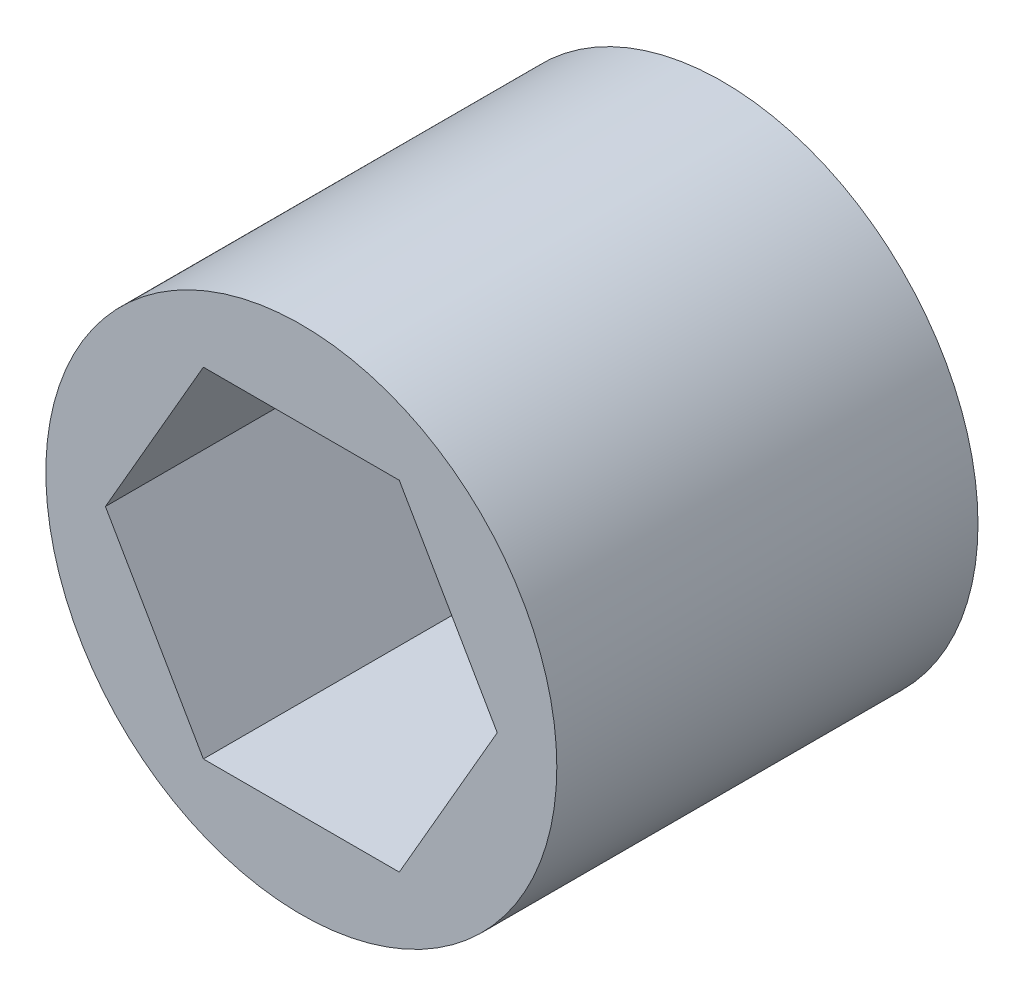
ISO-10303-21;
HEADER;
FILE_DESCRIPTION(('STEP AP214'),'2;1');
FILE_NAME('part.step','',(''),(''),'','','');
FILE_SCHEMA(('AUTOMOTIVE_DESIGN { 1 0 10303 214 1 1 1 1 }'));
ENDSEC;
DATA;
#1=APPLICATION_CONTEXT('core data for automotive mechanical design processes');
#2=APPLICATION_PROTOCOL_DEFINITION('international standard','automotive_design',2000,#1);
#3=PRODUCT_CONTEXT('',#1,'mechanical');
#4=PRODUCT('Part','Part','',(#3));
#5=PRODUCT_RELATED_PRODUCT_CATEGORY('part','',(#4));
#6=PRODUCT_DEFINITION_FORMATION('','',#4);
#7=PRODUCT_DEFINITION_CONTEXT('part definition',#1,'design');
#8=PRODUCT_DEFINITION('design','',#6,#7);
#9=PRODUCT_DEFINITION_SHAPE('','',#8);
#10=(LENGTH_UNIT() NAMED_UNIT(*) SI_UNIT(.MILLI.,.METRE.));
#11=(NAMED_UNIT(*) PLANE_ANGLE_UNIT() SI_UNIT($,.RADIAN.));
#12=(NAMED_UNIT(*) SI_UNIT($,.STERADIAN.) SOLID_ANGLE_UNIT());
#13=UNCERTAINTY_MEASURE_WITH_UNIT(LENGTH_MEASURE(1.E-05),#10,'distance_accuracy_value','');
#14=(GEOMETRIC_REPRESENTATION_CONTEXT(3) GLOBAL_UNCERTAINTY_ASSIGNED_CONTEXT((#13)) GLOBAL_UNIT_ASSIGNED_CONTEXT((#10,
#11,#12)) REPRESENTATION_CONTEXT('',''));
#15=CARTESIAN_POINT('',(0.,0.,0.));
#16=DIRECTION('',(0.,0.,1.));
#17=DIRECTION('',(1.,0.,0.));
#18=AXIS2_PLACEMENT_3D('',#15,#16,#17);
#19=CARTESIAN_POINT('',(0.,0.,16.0782));
#20=DIRECTION('',(0.,0.,1.));
#21=DIRECTION('',(1.,0.,0.));
#22=AXIS2_PLACEMENT_3D('',#19,#20,#21);
#23=PLANE('',#22);
#24=CARTESIAN_POINT('',(0.,0.,16.0782));
#25=DIRECTION('',(0.,0.,1.));
#26=DIRECTION('',(1.,0.,0.));
#27=AXIS2_PLACEMENT_3D('',#24,#25,#26);
#28=CIRCLE('',#27,9.7536);
#29=CARTESIAN_POINT('',(9.7536,0.,16.0782));
#30=VERTEX_POINT('',#29);
#31=EDGE_CURVE('E11',#30,#30,#28,.T.);
#32=ORIENTED_EDGE('',*,*,#31,.T.);
#33=EDGE_LOOP('',(#32));
#34=FACE_BOUND('',#33,.T.);
#35=DIRECTION('',(-0.5,0.866025403784438,0.));
#36=VECTOR('',#35,1.);
#37=CARTESIAN_POINT('',(7.47899538708242,0.,16.0782));
#38=LINE('',#37,#36);
#39=CARTESIAN_POINT('',(7.47899538708242,0.,16.0782));
#40=VERTEX_POINT('',#39);
#41=CARTESIAN_POINT('',(3.73949769354121,6.477,16.0782));
#42=VERTEX_POINT('',#41);
#43=EDGE_CURVE('E94',#40,#42,#38,.T.);
#44=ORIENTED_EDGE('',*,*,#43,.F.);
#45=DIRECTION('',(0.5,0.866025403784439,0.));
#46=VECTOR('',#45,1.);
#47=CARTESIAN_POINT('',(3.73949769354121,-6.477,16.0782));
#48=LINE('',#47,#46);
#49=CARTESIAN_POINT('',(3.73949769354121,-6.477,16.0782));
#50=VERTEX_POINT('',#49);
#51=EDGE_CURVE('E86',#50,#40,#48,.T.);
#52=ORIENTED_EDGE('',*,*,#51,.F.);
#53=DIRECTION('',(1.,0.,0.));
#54=VECTOR('',#53,1.);
#55=CARTESIAN_POINT('',(-3.7394976935412,-6.477,16.0782));
#56=LINE('',#55,#54);
#57=CARTESIAN_POINT('',(-3.7394976935412,-6.477,16.0782));
#58=VERTEX_POINT('',#57);
#59=EDGE_CURVE('E114',#58,#50,#56,.T.);
#60=ORIENTED_EDGE('',*,*,#59,.F.);
#61=DIRECTION('',(0.5,-0.866025403784438,0.));
#62=VECTOR('',#61,1.);
#63=CARTESIAN_POINT('',(-7.47899538708241,0.,16.0782));
#64=LINE('',#63,#62);
#65=CARTESIAN_POINT('',(-7.47899538708241,0.,16.0782));
#66=VERTEX_POINT('',#65);
#67=EDGE_CURVE('E112',#66,#58,#64,.T.);
#68=ORIENTED_EDGE('',*,*,#67,.F.);
#69=DIRECTION('',(-0.5,-0.866025403784439,0.));
#70=VECTOR('',#69,1.);
#71=CARTESIAN_POINT('',(-3.7394976935412,6.477,16.0782));
#72=LINE('',#71,#70);
#73=CARTESIAN_POINT('',(-3.7394976935412,6.477,16.0782));
#74=VERTEX_POINT('',#73);
#75=EDGE_CURVE('E108',#74,#66,#72,.T.);
#76=ORIENTED_EDGE('',*,*,#75,.F.);
#77=DIRECTION('',(-1.,0.,0.));
#78=VECTOR('',#77,1.);
#79=CARTESIAN_POINT('',(3.73949769354121,6.477,16.0782));
#80=LINE('',#79,#78);
#81=EDGE_CURVE('E106',#42,#74,#80,.T.);
#82=ORIENTED_EDGE('',*,*,#81,.F.);
#83=EDGE_LOOP('',(#44,#52,#60,#68,#76,#82));
#84=FACE_BOUND('',#83,.T.);
#85=ADVANCED_FACE('F33',(#34,#84),#23,.T.);
#86=CARTESIAN_POINT('',(0.,0.,0.));
#87=DIRECTION('',(0.,0.,1.));
#88=DIRECTION('',(1.,0.,0.));
#89=AXIS2_PLACEMENT_3D('',#86,#87,#88);
#90=PLANE('',#89);
#91=CARTESIAN_POINT('',(0.,0.,0.));
#92=DIRECTION('',(0.,0.,1.));
#93=DIRECTION('',(1.,0.,0.));
#94=AXIS2_PLACEMENT_3D('',#91,#92,#93);
#95=CIRCLE('',#94,9.7536);
#96=CARTESIAN_POINT('',(9.7536,0.,0.));
#97=VERTEX_POINT('',#96);
#98=EDGE_CURVE('E37',#97,#97,#95,.T.);
#99=ORIENTED_EDGE('',*,*,#98,.F.);
#100=EDGE_LOOP('',(#99));
#101=FACE_BOUND('',#100,.T.);
#102=DIRECTION('',(0.5,0.866025403784439,0.));
#103=VECTOR('',#102,1.);
#104=CARTESIAN_POINT('',(3.73949769354121,-6.477,0.));
#105=LINE('',#104,#103);
#106=CARTESIAN_POINT('',(3.73949769354121,-6.477,0.));
#107=VERTEX_POINT('',#106);
#108=CARTESIAN_POINT('',(7.47899538708242,0.,0.));
#109=VERTEX_POINT('',#108);
#110=EDGE_CURVE('E56',#107,#109,#105,.T.);
#111=ORIENTED_EDGE('',*,*,#110,.T.);
#112=DIRECTION('',(-0.5,0.866025403784438,0.));
#113=VECTOR('',#112,1.);
#114=CARTESIAN_POINT('',(7.47899538708242,0.,0.));
#115=LINE('',#114,#113);
#116=CARTESIAN_POINT('',(3.73949769354121,6.477,0.));
#117=VERTEX_POINT('',#116);
#118=EDGE_CURVE('E101',#109,#117,#115,.T.);
#119=ORIENTED_EDGE('',*,*,#118,.T.);
#120=DIRECTION('',(-1.,0.,0.));
#121=VECTOR('',#120,1.);
#122=CARTESIAN_POINT('',(3.73949769354121,6.477,0.));
#123=LINE('',#122,#121);
#124=CARTESIAN_POINT('',(-3.7394976935412,6.477,0.));
#125=VERTEX_POINT('',#124);
#126=EDGE_CURVE('E118',#117,#125,#123,.T.);
#127=ORIENTED_EDGE('',*,*,#126,.T.);
#128=DIRECTION('',(-0.5,-0.866025403784439,0.));
#129=VECTOR('',#128,1.);
#130=CARTESIAN_POINT('',(-3.7394976935412,6.477,0.));
#131=LINE('',#130,#129);
#132=CARTESIAN_POINT('',(-7.47899538708241,0.,0.));
#133=VERTEX_POINT('',#132);
#134=EDGE_CURVE('E121',#125,#133,#131,.T.);
#135=ORIENTED_EDGE('',*,*,#134,.T.);
#136=DIRECTION('',(0.5,-0.866025403784438,0.));
#137=VECTOR('',#136,1.);
#138=CARTESIAN_POINT('',(-7.47899538708241,0.,0.));
#139=LINE('',#138,#137);
#140=CARTESIAN_POINT('',(-3.7394976935412,-6.477,0.));
#141=VERTEX_POINT('',#140);
#142=EDGE_CURVE('E124',#133,#141,#139,.T.);
#143=ORIENTED_EDGE('',*,*,#142,.T.);
#144=DIRECTION('',(1.,0.,0.));
#145=VECTOR('',#144,1.);
#146=CARTESIAN_POINT('',(-3.7394976935412,-6.477,0.));
#147=LINE('',#146,#145);
#148=EDGE_CURVE('E95',#141,#107,#147,.T.);
#149=ORIENTED_EDGE('',*,*,#148,.T.);
#150=EDGE_LOOP('',(#111,#119,#127,#135,#143,#149));
#151=FACE_BOUND('',#150,.T.);
#152=ADVANCED_FACE('F141',(#101,#151),#90,.F.);
#153=CARTESIAN_POINT('',(0.,0.,16.0782));
#154=DIRECTION('',(0.,0.,-1.));
#155=DIRECTION('',(-1.,0.,0.));
#156=AXIS2_PLACEMENT_3D('',#153,#154,#155);
#157=CYLINDRICAL_SURFACE('',#156,9.7536);
#158=ORIENTED_EDGE('',*,*,#31,.F.);
#159=EDGE_LOOP('',(#158));
#160=FACE_BOUND('',#159,.T.);
#161=ORIENTED_EDGE('',*,*,#98,.T.);
#162=EDGE_LOOP('',(#161));
#163=FACE_BOUND('',#162,.T.);
#164=ADVANCED_FACE('F35',(#160,#163),#157,.T.);
#165=CARTESIAN_POINT('',(3.73949769354121,-6.477,16.0782));
#166=DIRECTION('',(-0.866025403784439,0.5,0.));
#167=DIRECTION('',(-0.5,-0.866025403784439,0.));
#168=AXIS2_PLACEMENT_3D('',#165,#166,#167);
#169=PLANE('',#168);
#170=ORIENTED_EDGE('',*,*,#110,.F.);
#171=DIRECTION('',(0.,0.,-1.));
#172=VECTOR('',#171,1.);
#173=CARTESIAN_POINT('',(3.73949769354121,-6.477,16.0782));
#174=LINE('',#173,#172);
#175=EDGE_CURVE('E90',#50,#107,#174,.T.);
#176=ORIENTED_EDGE('',*,*,#175,.F.);
#177=ORIENTED_EDGE('',*,*,#51,.T.);
#178=DIRECTION('',(0.,0.,-1.));
#179=VECTOR('',#178,1.);
#180=CARTESIAN_POINT('',(7.47899538708242,0.,16.0782));
#181=LINE('',#180,#179);
#182=EDGE_CURVE('E89',#40,#109,#181,.T.);
#183=ORIENTED_EDGE('',*,*,#182,.T.);
#184=EDGE_LOOP('',(#170,#176,#177,#183));
#185=FACE_BOUND('',#184,.T.);
#186=ADVANCED_FACE('F88',(#185),#169,.T.);
#187=CARTESIAN_POINT('',(7.47899538708242,0.,16.0782));
#188=DIRECTION('',(-0.866025403784438,-0.5,0.));
#189=DIRECTION('',(0.5,-0.866025403784438,0.));
#190=AXIS2_PLACEMENT_3D('',#187,#188,#189);
#191=PLANE('',#190);
#192=ORIENTED_EDGE('',*,*,#118,.F.);
#193=ORIENTED_EDGE('',*,*,#182,.F.);
#194=ORIENTED_EDGE('',*,*,#43,.T.);
#195=DIRECTION('',(0.,0.,-1.));
#196=VECTOR('',#195,1.);
#197=CARTESIAN_POINT('',(3.73949769354121,6.477,16.0782));
#198=LINE('',#197,#196);
#199=EDGE_CURVE('E102',#42,#117,#198,.T.);
#200=ORIENTED_EDGE('',*,*,#199,.T.);
#201=EDGE_LOOP('',(#192,#193,#194,#200));
#202=FACE_BOUND('',#201,.T.);
#203=ADVANCED_FACE('F98',(#202),#191,.T.);
#204=CARTESIAN_POINT('',(3.73949769354121,6.477,16.0782));
#205=DIRECTION('',(0.,-1.,0.));
#206=DIRECTION('',(0.,0.,-1.));
#207=AXIS2_PLACEMENT_3D('',#204,#205,#206);
#208=PLANE('',#207);
#209=ORIENTED_EDGE('',*,*,#126,.F.);
#210=ORIENTED_EDGE('',*,*,#199,.F.);
#211=ORIENTED_EDGE('',*,*,#81,.T.);
#212=DIRECTION('',(0.,0.,-1.));
#213=VECTOR('',#212,1.);
#214=CARTESIAN_POINT('',(-3.7394976935412,6.477,16.0782));
#215=LINE('',#214,#213);
#216=EDGE_CURVE('E133',#74,#125,#215,.T.);
#217=ORIENTED_EDGE('',*,*,#216,.T.);
#218=EDGE_LOOP('',(#209,#210,#211,#217));
#219=FACE_BOUND('',#218,.T.);
#220=ADVANCED_FACE('F137',(#219),#208,.T.);
#221=CARTESIAN_POINT('',(-3.7394976935412,6.477,16.0782));
#222=DIRECTION('',(0.866025403784439,-0.5,0.));
#223=DIRECTION('',(0.5,0.866025403784439,0.));
#224=AXIS2_PLACEMENT_3D('',#221,#222,#223);
#225=PLANE('',#224);
#226=ORIENTED_EDGE('',*,*,#134,.F.);
#227=ORIENTED_EDGE('',*,*,#216,.F.);
#228=ORIENTED_EDGE('',*,*,#75,.T.);
#229=DIRECTION('',(0.,0.,-1.));
#230=VECTOR('',#229,1.);
#231=CARTESIAN_POINT('',(-7.47899538708241,0.,16.0782));
#232=LINE('',#231,#230);
#233=EDGE_CURVE('E131',#66,#133,#232,.T.);
#234=ORIENTED_EDGE('',*,*,#233,.T.);
#235=EDGE_LOOP('',(#226,#227,#228,#234));
#236=FACE_BOUND('',#235,.T.);
#237=ADVANCED_FACE('F149',(#236),#225,.T.);
#238=CARTESIAN_POINT('',(-7.47899538708241,0.,16.0782));
#239=DIRECTION('',(0.866025403784438,0.5,0.));
#240=DIRECTION('',(-0.5,0.866025403784439,0.));
#241=AXIS2_PLACEMENT_3D('',#238,#239,#240);
#242=PLANE('',#241);
#243=ORIENTED_EDGE('',*,*,#142,.F.);
#244=ORIENTED_EDGE('',*,*,#233,.F.);
#245=ORIENTED_EDGE('',*,*,#67,.T.);
#246=DIRECTION('',(0.,0.,-1.));
#247=VECTOR('',#246,1.);
#248=CARTESIAN_POINT('',(-3.7394976935412,-6.477,16.0782));
#249=LINE('',#248,#247);
#250=EDGE_CURVE('E48',#58,#141,#249,.T.);
#251=ORIENTED_EDGE('',*,*,#250,.T.);
#252=EDGE_LOOP('',(#243,#244,#245,#251));
#253=FACE_BOUND('',#252,.T.);
#254=ADVANCED_FACE('F147',(#253),#242,.T.);
#255=CARTESIAN_POINT('',(-3.7394976935412,-6.477,16.0782));
#256=DIRECTION('',(0.,1.,0.));
#257=DIRECTION('',(-1.,0.,0.));
#258=AXIS2_PLACEMENT_3D('',#255,#256,#257);
#259=PLANE('',#258);
#260=ORIENTED_EDGE('',*,*,#148,.F.);
#261=ORIENTED_EDGE('',*,*,#250,.F.);
#262=ORIENTED_EDGE('',*,*,#59,.T.);
#263=ORIENTED_EDGE('',*,*,#175,.T.);
#264=EDGE_LOOP('',(#260,#261,#262,#263));
#265=FACE_BOUND('',#264,.T.);
#266=ADVANCED_FACE('F143',(#265),#259,.T.);
#267=CLOSED_SHELL('',(#85,#152,#164,#186,#203,#220,#237,#254,#266));
#268=MANIFOLD_SOLID_BREP('B2',#267);
#269=ADVANCED_BREP_SHAPE_REPRESENTATION('',(#18,#268),#14);
#270=SHAPE_DEFINITION_REPRESENTATION(#9,#269);
ENDSEC;
END-ISO-10303-21;
